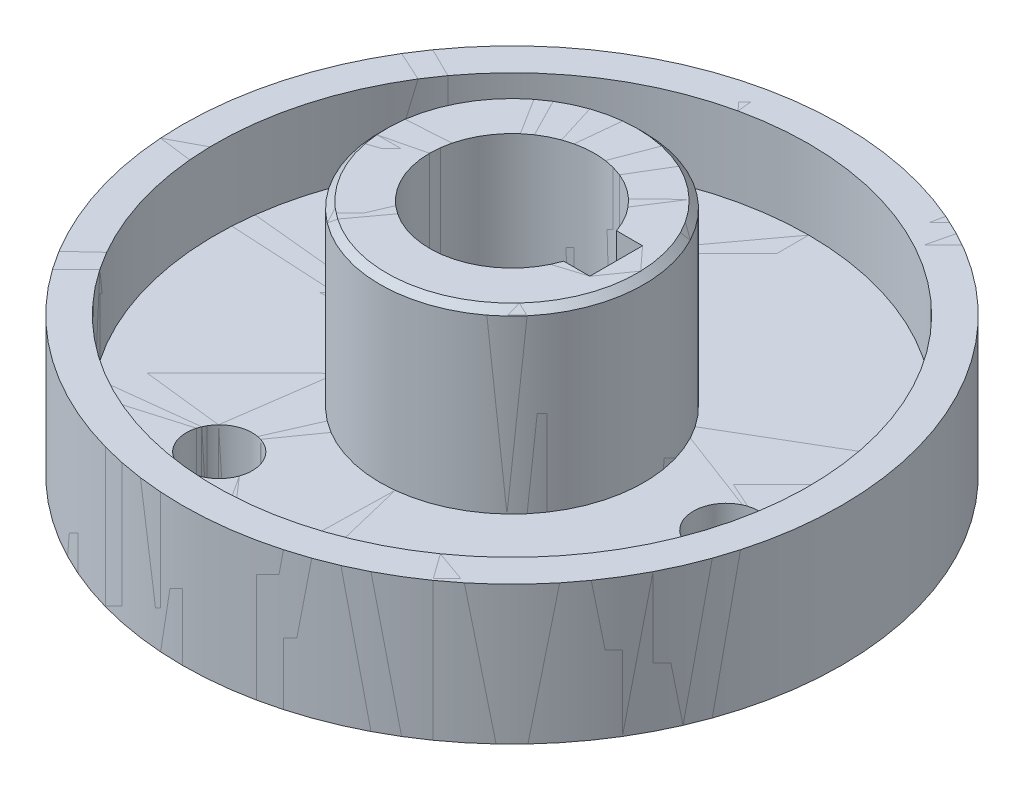
ISO-10303-21;
HEADER;
FILE_DESCRIPTION(('STEP AP214'),'2;1');
FILE_NAME('part.step','',(''),(''),'','','');
FILE_SCHEMA(('AUTOMOTIVE_DESIGN { 1 0 10303 214 1 1 1 1 }'));
ENDSEC;
DATA;
#1=APPLICATION_CONTEXT('core data for automotive mechanical design processes');
#2=APPLICATION_PROTOCOL_DEFINITION('international standard','automotive_design',2000,#1);
#3=PRODUCT_CONTEXT('',#1,'mechanical');
#4=PRODUCT('Part','Part','',(#3));
#5=PRODUCT_RELATED_PRODUCT_CATEGORY('part','',(#4));
#6=PRODUCT_DEFINITION_FORMATION('','',#4);
#7=PRODUCT_DEFINITION_CONTEXT('part definition',#1,'design');
#8=PRODUCT_DEFINITION('design','',#6,#7);
#9=PRODUCT_DEFINITION_SHAPE('','',#8);
#10=(LENGTH_UNIT() NAMED_UNIT(*) SI_UNIT(.MILLI.,.METRE.));
#11=(NAMED_UNIT(*) PLANE_ANGLE_UNIT() SI_UNIT($,.RADIAN.));
#12=(NAMED_UNIT(*) SI_UNIT($,.STERADIAN.) SOLID_ANGLE_UNIT());
#13=UNCERTAINTY_MEASURE_WITH_UNIT(LENGTH_MEASURE(1.E-05),#10,'distance_accuracy_value','');
#14=(GEOMETRIC_REPRESENTATION_CONTEXT(3) GLOBAL_UNCERTAINTY_ASSIGNED_CONTEXT((#13)) GLOBAL_UNIT_ASSIGNED_CONTEXT((#10,
#11,#12)) REPRESENTATION_CONTEXT('',''));
#15=CARTESIAN_POINT('',(0.,0.,0.));
#16=DIRECTION('',(0.,0.,1.));
#17=DIRECTION('',(1.,0.,0.));
#18=AXIS2_PLACEMENT_3D('',#15,#16,#17);
#19=CARTESIAN_POINT('',(0.,13.,20.));
#20=DIRECTION('',(0.,-1.,0.));
#21=DIRECTION('',(0.,0.,-1.));
#22=AXIS2_PLACEMENT_3D('',#19,#20,#21);
#23=PLANE('',#22);
#24=CARTESIAN_POINT('',(32.5,12.9999999999999,0.));
#25=DIRECTION('',(0.,1.,0.));
#26=DIRECTION('',(0.,0.,1.));
#27=AXIS2_PLACEMENT_3D('',#24,#25,#26);
#28=CIRCLE('',#27,4.99999999999999);
#29=CARTESIAN_POINT('',(32.5,12.9999999999999,5.00000000000003));
#30=VERTEX_POINT('',#29);
#31=EDGE_CURVE('E210',#30,#30,#28,.T.);
#32=ORIENTED_EDGE('',*,*,#31,.F.);
#33=EDGE_LOOP('',(#32));
#34=FACE_BOUND('',#33,.T.);
#35=CARTESIAN_POINT('',(-16.25,13.,-28.1458256229942));
#36=DIRECTION('',(0.,1.,0.));
#37=DIRECTION('',(0.,0.,1.));
#38=AXIS2_PLACEMENT_3D('',#35,#36,#37);
#39=CIRCLE('',#38,5.);
#40=CARTESIAN_POINT('',(-16.25,13.,-23.1458256229942));
#41=VERTEX_POINT('',#40);
#42=EDGE_CURVE('E218',#41,#41,#39,.T.);
#43=ORIENTED_EDGE('',*,*,#42,.F.);
#44=EDGE_LOOP('',(#43));
#45=FACE_BOUND('',#44,.T.);
#46=CARTESIAN_POINT('',(0.,13.0000000000001,0.));
#47=DIRECTION('',(0.,-1.,0.));
#48=DIRECTION('',(0.,0.,-1.));
#49=AXIS2_PLACEMENT_3D('',#46,#47,#48);
#50=CIRCLE('',#49,45.);
#51=CARTESIAN_POINT('',(0.,13.0000000000003,-44.9999999999999));
#52=VERTEX_POINT('',#51);
#53=EDGE_CURVE('E165',#52,#52,#50,.T.);
#54=ORIENTED_EDGE('',*,*,#53,.F.);
#55=EDGE_LOOP('',(#54));
#56=FACE_BOUND('',#55,.T.);
#57=CARTESIAN_POINT('',(0.,13.0000000000001,0.));
#58=DIRECTION('',(0.,-1.,0.));
#59=DIRECTION('',(0.,0.,-1.));
#60=AXIS2_PLACEMENT_3D('',#57,#58,#59);
#61=CIRCLE('',#60,20.);
#62=CARTESIAN_POINT('',(0.,13.0000000000002,-19.9999999999999));
#63=VERTEX_POINT('',#62);
#64=EDGE_CURVE('E161',#63,#63,#61,.T.);
#65=ORIENTED_EDGE('',*,*,#64,.T.);
#66=EDGE_LOOP('',(#65));
#67=FACE_BOUND('',#66,.T.);
#68=CARTESIAN_POINT('',(-16.25,12.9999999999998,28.1458256229943));
#69=DIRECTION('',(0.,1.,0.));
#70=DIRECTION('',(0.,0.,1.));
#71=AXIS2_PLACEMENT_3D('',#68,#69,#70);
#72=CIRCLE('',#71,5.);
#73=CARTESIAN_POINT('',(-16.25,12.9999999999998,33.1458256229943));
#74=VERTEX_POINT('',#73);
#75=EDGE_CURVE('E207',#74,#74,#72,.T.);
#76=ORIENTED_EDGE('',*,*,#75,.F.);
#77=EDGE_LOOP('',(#76));
#78=FACE_BOUND('',#77,.T.);
#79=ADVANCED_FACE('F55',(#34,#45,#56,#67,#78),#23,.F.);
#80=CARTESIAN_POINT('',(0.,3.99999999999999,50.));
#81=DIRECTION('',(0.,1.,0.));
#82=DIRECTION('',(0.,0.,1.));
#83=AXIS2_PLACEMENT_3D('',#80,#81,#82);
#84=PLANE('',#83);
#85=CARTESIAN_POINT('',(0.,4.00000000000011,0.));
#86=DIRECTION('',(0.,-1.,0.));
#87=DIRECTION('',(0.,0.,-1.));
#88=AXIS2_PLACEMENT_3D('',#85,#86,#87);
#89=CIRCLE('',#88,42.);
#90=CARTESIAN_POINT('',(0.,4.00000000000026,-42.));
#91=VERTEX_POINT('',#90);
#92=EDGE_CURVE('E138',#91,#91,#89,.T.);
#93=ORIENTED_EDGE('',*,*,#92,.F.);
#94=EDGE_LOOP('',(#93));
#95=FACE_BOUND('',#94,.T.);
#96=CARTESIAN_POINT('',(0.,4.00000000000023,0.));
#97=DIRECTION('',(0.,-1.,0.));
#98=DIRECTION('',(0.,0.,-1.));
#99=AXIS2_PLACEMENT_3D('',#96,#97,#98);
#100=CIRCLE('',#99,50.);
#101=CARTESIAN_POINT('',(0.,4.0000000000004,-50.));
#102=VERTEX_POINT('',#101);
#103=EDGE_CURVE('E64',#102,#102,#100,.T.);
#104=ORIENTED_EDGE('',*,*,#103,.T.);
#105=EDGE_LOOP('',(#104));
#106=FACE_BOUND('',#105,.T.);
#107=ADVANCED_FACE('F57',(#95,#106),#84,.F.);
#108=CARTESIAN_POINT('',(0.,-885.837413968928,-3.03864290244247E-12));
#109=DIRECTION('',(0.,-1.,0.));
#110=DIRECTION('',(0.,0.,-1.));
#111=AXIS2_PLACEMENT_3D('',#108,#109,#110);
#112=CYLINDRICAL_SURFACE('',#111,50.);
#113=ORIENTED_EDGE('',*,*,#103,.F.);
#114=EDGE_LOOP('',(#113));
#115=FACE_BOUND('',#114,.T.);
#116=CARTESIAN_POINT('',(0.,25.0000000000002,0.));
#117=DIRECTION('',(0.,-1.,0.));
#118=DIRECTION('',(0.,0.,-1.));
#119=AXIS2_PLACEMENT_3D('',#116,#117,#118);
#120=CIRCLE('',#119,49.9999999999999);
#121=CARTESIAN_POINT('',(0.,25.0000000000004,-49.9999999999998));
#122=VERTEX_POINT('',#121);
#123=EDGE_CURVE('E173',#122,#122,#120,.T.);
#124=ORIENTED_EDGE('',*,*,#123,.T.);
#125=EDGE_LOOP('',(#124));
#126=FACE_BOUND('',#125,.T.);
#127=ADVANCED_FACE('F181',(#115,#126),#112,.T.);
#128=CARTESIAN_POINT('',(0.,25.,45.));
#129=DIRECTION('',(0.,-1.,0.));
#130=DIRECTION('',(0.,0.,-1.));
#131=AXIS2_PLACEMENT_3D('',#128,#129,#130);
#132=PLANE('',#131);
#133=ORIENTED_EDGE('',*,*,#123,.F.);
#134=EDGE_LOOP('',(#133));
#135=FACE_BOUND('',#134,.T.);
#136=CARTESIAN_POINT('',(0.,25.0000000000001,0.));
#137=DIRECTION('',(0.,-1.,0.));
#138=DIRECTION('',(0.,0.,-1.));
#139=AXIS2_PLACEMENT_3D('',#136,#137,#138);
#140=CIRCLE('',#139,44.9999999999999);
#141=CARTESIAN_POINT('',(0.,25.0000000000003,-44.9999999999998));
#142=VERTEX_POINT('',#141);
#143=EDGE_CURVE('E169',#142,#142,#140,.T.);
#144=ORIENTED_EDGE('',*,*,#143,.T.);
#145=EDGE_LOOP('',(#144));
#146=FACE_BOUND('',#145,.T.);
#147=ADVANCED_FACE('F184',(#135,#146),#132,.F.);
#148=CARTESIAN_POINT('',(0.,-885.837413968928,-3.03864290244247E-12));
#149=DIRECTION('',(0.,-1.,0.));
#150=DIRECTION('',(0.,0.,-1.));
#151=AXIS2_PLACEMENT_3D('',#148,#149,#150);
#152=CYLINDRICAL_SURFACE('',#151,44.9999999999999);
#153=ORIENTED_EDGE('',*,*,#143,.F.);
#154=EDGE_LOOP('',(#153));
#155=FACE_BOUND('',#154,.T.);
#156=ORIENTED_EDGE('',*,*,#53,.T.);
#157=EDGE_LOOP('',(#156));
#158=FACE_BOUND('',#157,.T.);
#159=ADVANCED_FACE('F189',(#155,#158),#152,.F.);
#160=CARTESIAN_POINT('',(0.,-885.837413968928,-3.03864290244247E-12));
#161=DIRECTION('',(0.,-1.,0.));
#162=DIRECTION('',(0.,0.,-1.));
#163=AXIS2_PLACEMENT_3D('',#160,#161,#162);
#164=CYLINDRICAL_SURFACE('',#163,19.9999999999999);
#165=ORIENTED_EDGE('',*,*,#64,.F.);
#166=EDGE_LOOP('',(#165));
#167=FACE_BOUND('',#166,.T.);
#168=CARTESIAN_POINT('',(0.,39.0000000000001,1.33779710956546E-13));
#169=DIRECTION('',(0.,-1.,0.));
#170=DIRECTION('',(0.,0.,-1.));
#171=AXIS2_PLACEMENT_3D('',#168,#169,#170);
#172=CIRCLE('',#171,19.9999999999999);
#173=CARTESIAN_POINT('',(0.,39.0000000000002,-19.9999999999997));
#174=VERTEX_POINT('',#173);
#175=EDGE_CURVE('E157',#174,#174,#172,.T.);
#176=ORIENTED_EDGE('',*,*,#175,.T.);
#177=EDGE_LOOP('',(#176));
#178=FACE_BOUND('',#177,.T.);
#179=ADVANCED_FACE('F195',(#167,#178),#164,.T.);
#180=CARTESIAN_POINT('',(0.,40.0000000000001,1.37209959955431E-13));
#181=DIRECTION('',(0.,-1.,0.));
#182=DIRECTION('',(0.,0.,-1.));
#183=AXIS2_PLACEMENT_3D('',#180,#181,#182);
#184=CONICAL_SURFACE('',#183,18.9999999999999,0.78539816339745);
#185=ORIENTED_EDGE('',*,*,#175,.F.);
#186=EDGE_LOOP('',(#185));
#187=FACE_BOUND('',#186,.T.);
#188=CARTESIAN_POINT('',(0.,40.0000000000001,1.37209959955431E-13));
#189=DIRECTION('',(0.,-1.,0.));
#190=DIRECTION('',(0.,0.,-1.));
#191=AXIS2_PLACEMENT_3D('',#188,#189,#190);
#192=CIRCLE('',#191,18.9999999999999);
#193=CARTESIAN_POINT('',(0.,40.0000000000002,-18.9999999999997));
#194=VERTEX_POINT('',#193);
#195=EDGE_CURVE('E153',#194,#194,#192,.T.);
#196=ORIENTED_EDGE('',*,*,#195,.T.);
#197=EDGE_LOOP('',(#196));
#198=FACE_BOUND('',#197,.T.);
#199=ADVANCED_FACE('F263',(#187,#198),#184,.T.);
#200=CARTESIAN_POINT('',(0.,40.,12.5));
#201=DIRECTION('',(0.,-1.,0.));
#202=DIRECTION('',(0.,0.,-1.));
#203=AXIS2_PLACEMENT_3D('',#200,#201,#202);
#204=PLANE('',#203);
#205=ORIENTED_EDGE('',*,*,#195,.F.);
#206=EDGE_LOOP('',(#205));
#207=FACE_BOUND('',#206,.T.);
#208=DIRECTION('',(0.,0.,-1.));
#209=VECTOR('',#208,1.);
#210=CARTESIAN_POINT('',(15.8000000000001,40.,4.00000000000014));
#211=LINE('',#210,#209);
#212=CARTESIAN_POINT('',(15.8000000000001,40.,4.00000000000014));
#213=VERTEX_POINT('',#212);
#214=CARTESIAN_POINT('',(15.8000000000001,40.0000000000001,-3.99999999999986));
#215=VERTEX_POINT('',#214);
#216=EDGE_CURVE('E102',#213,#215,#211,.T.);
#217=ORIENTED_EDGE('',*,*,#216,.F.);
#218=DIRECTION('',(1.,0.,0.));
#219=VECTOR('',#218,1.);
#220=CARTESIAN_POINT('',(9.19999999999957,40.,4.00000000000014));
#221=LINE('',#220,#219);
#222=CARTESIAN_POINT('',(11.8427192823269,40.,4.00000000000014));
#223=VERTEX_POINT('',#222);
#224=EDGE_CURVE('E117',#223,#213,#221,.T.);
#225=ORIENTED_EDGE('',*,*,#224,.F.);
#226=CARTESIAN_POINT('',(0.,40.,1.37209959955431E-13));
#227=DIRECTION('',(0.,-1.,0.));
#228=DIRECTION('',(0.,0.,-1.));
#229=AXIS2_PLACEMENT_3D('',#226,#227,#228);
#230=CIRCLE('',#229,12.4999999999999);
#231=CARTESIAN_POINT('',(11.8427192823269,40.,-3.99999999999986));
#232=VERTEX_POINT('',#231);
#233=EDGE_CURVE('E149',#223,#232,#230,.T.);
#234=ORIENTED_EDGE('',*,*,#233,.T.);
#235=DIRECTION('',(-1.,0.,0.));
#236=VECTOR('',#235,1.);
#237=CARTESIAN_POINT('',(9.19999999999957,40.0000000000001,-3.99999999999986));
#238=LINE('',#237,#236);
#239=EDGE_CURVE('E120',#215,#232,#238,.T.);
#240=ORIENTED_EDGE('',*,*,#239,.F.);
#241=EDGE_LOOP('',(#217,#225,#234,#240));
#242=FACE_BOUND('',#241,.T.);
#243=ADVANCED_FACE('F259',(#207,#242),#204,.F.);
#244=CARTESIAN_POINT('',(0.,-885.837413968928,-3.03864290244247E-12));
#245=DIRECTION('',(0.,-1.,0.));
#246=DIRECTION('',(0.,0.,-1.));
#247=AXIS2_PLACEMENT_3D('',#244,#245,#246);
#248=CYLINDRICAL_SURFACE('',#247,12.4999999999999);
#249=ORIENTED_EDGE('',*,*,#233,.F.);
#250=DIRECTION('',(0.,-1.,0.));
#251=VECTOR('',#250,1.);
#252=CARTESIAN_POINT('',(11.8427192823269,-885.837413968928,3.99999999999696));
#253=LINE('',#252,#251);
#254=CARTESIAN_POINT('',(11.842719282327,-1.52655665885959E-13,4.));
#255=VERTEX_POINT('',#254);
#256=EDGE_CURVE('E135',#223,#255,#253,.T.);
#257=ORIENTED_EDGE('',*,*,#256,.T.);
#258=CARTESIAN_POINT('',(0.,0.,0.));
#259=DIRECTION('',(0.,-1.,0.));
#260=DIRECTION('',(0.,0.,-1.));
#261=AXIS2_PLACEMENT_3D('',#258,#259,#260);
#262=CIRCLE('',#261,12.5);
#263=CARTESIAN_POINT('',(11.842719282327,0.,-4.));
#264=VERTEX_POINT('',#263);
#265=EDGE_CURVE('E146',#255,#264,#262,.T.);
#266=ORIENTED_EDGE('',*,*,#265,.T.);
#267=DIRECTION('',(0.,-1.,0.));
#268=VECTOR('',#267,1.);
#269=CARTESIAN_POINT('',(11.8427192823269,-885.837413968928,-4.00000000000304));
#270=LINE('',#269,#268);
#271=EDGE_CURVE('E71',#264,#232,#270,.F.);
#272=ORIENTED_EDGE('',*,*,#271,.T.);
#273=EDGE_LOOP('',(#249,#257,#266,#272));
#274=FACE_BOUND('',#273,.T.);
#275=ADVANCED_FACE('F255',(#274),#248,.F.);
#276=CARTESIAN_POINT('',(0.,0.,42.));
#277=DIRECTION('',(0.,1.,0.));
#278=DIRECTION('',(0.,0.,1.));
#279=AXIS2_PLACEMENT_3D('',#276,#277,#278);
#280=PLANE('',#279);
#281=CARTESIAN_POINT('',(32.5,-3.24393290007663E-13,0.));
#282=DIRECTION('',(0.,1.,0.));
#283=DIRECTION('',(0.,0.,1.));
#284=AXIS2_PLACEMENT_3D('',#281,#282,#283);
#285=CIRCLE('',#284,4.99999999999999);
#286=CARTESIAN_POINT('',(32.5,-3.41544535002092E-13,4.99999999999999));
#287=VERTEX_POINT('',#286);
#288=EDGE_CURVE('E128',#287,#287,#285,.T.);
#289=ORIENTED_EDGE('',*,*,#288,.T.);
#290=EDGE_LOOP('',(#289));
#291=FACE_BOUND('',#290,.T.);
#292=CARTESIAN_POINT('',(-16.25,-4.21537804662364E-13,28.1458256229943));
#293=DIRECTION('',(0.,1.,0.));
#294=DIRECTION('',(0.,0.,1.));
#295=AXIS2_PLACEMENT_3D('',#292,#293,#294);
#296=CIRCLE('',#295,5.);
#297=CARTESIAN_POINT('',(-16.25,-4.38689049656793E-13,33.1458256229943));
#298=VERTEX_POINT('',#297);
#299=EDGE_CURVE('E211',#298,#298,#296,.T.);
#300=ORIENTED_EDGE('',*,*,#299,.T.);
#301=EDGE_LOOP('',(#300));
#302=FACE_BOUND('',#301,.T.);
#303=CARTESIAN_POINT('',(-16.25,-2.27248775352962E-13,-28.1458256229943));
#304=DIRECTION('',(0.,1.,0.));
#305=DIRECTION('',(0.,0.,1.));
#306=AXIS2_PLACEMENT_3D('',#303,#304,#305);
#307=CIRCLE('',#306,5.);
#308=CARTESIAN_POINT('',(-16.25,-2.44400020347391E-13,-23.1458256229943));
#309=VERTEX_POINT('',#308);
#310=EDGE_CURVE('E123',#309,#309,#307,.T.);
#311=ORIENTED_EDGE('',*,*,#310,.T.);
#312=EDGE_LOOP('',(#311));
#313=FACE_BOUND('',#312,.T.);
#314=ORIENTED_EDGE('',*,*,#265,.F.);
#315=DIRECTION('',(1.,0.,0.));
#316=VECTOR('',#315,1.);
#317=CARTESIAN_POINT('',(0.,0.,4.));
#318=LINE('',#317,#316);
#319=CARTESIAN_POINT('',(15.8000000000001,-1.52655665885959E-13,4.));
#320=VERTEX_POINT('',#319);
#321=EDGE_CURVE('E12',#255,#320,#318,.T.);
#322=ORIENTED_EDGE('',*,*,#321,.T.);
#323=DIRECTION('',(0.,0.,-1.));
#324=VECTOR('',#323,1.);
#325=CARTESIAN_POINT('',(15.8000000000001,-1.52655665885959E-13,4.));
#326=LINE('',#325,#324);
#327=CARTESIAN_POINT('',(15.8000000000001,-1.2490009027033E-13,-4.));
#328=VERTEX_POINT('',#327);
#329=EDGE_CURVE('E100',#320,#328,#326,.T.);
#330=ORIENTED_EDGE('',*,*,#329,.T.);
#331=DIRECTION('',(-1.,0.,0.));
#332=VECTOR('',#331,1.);
#333=CARTESIAN_POINT('',(9.19999999999957,-1.2490009027033E-13,-4.));
#334=LINE('',#333,#332);
#335=EDGE_CURVE('E106',#328,#264,#334,.T.);
#336=ORIENTED_EDGE('',*,*,#335,.T.);
#337=EDGE_LOOP('',(#314,#322,#330,#336));
#338=FACE_BOUND('',#337,.T.);
#339=CARTESIAN_POINT('',(0.,1.11022302462516E-13,0.));
#340=DIRECTION('',(0.,-1.,0.));
#341=DIRECTION('',(0.,0.,-1.));
#342=AXIS2_PLACEMENT_3D('',#339,#340,#341);
#343=CIRCLE('',#342,42.);
#344=CARTESIAN_POINT('',(0.,2.55092760415718E-13,-42.));
#345=VERTEX_POINT('',#344);
#346=EDGE_CURVE('E142',#345,#345,#343,.T.);
#347=ORIENTED_EDGE('',*,*,#346,.T.);
#348=EDGE_LOOP('',(#347));
#349=FACE_BOUND('',#348,.T.);
#350=ADVANCED_FACE('F114',(#291,#302,#313,#338,#349),#280,.F.);
#351=CARTESIAN_POINT('',(0.,-885.837413968928,-3.03864290244247E-12));
#352=DIRECTION('',(0.,-1.,0.));
#353=DIRECTION('',(0.,0.,-1.));
#354=AXIS2_PLACEMENT_3D('',#351,#352,#353);
#355=CYLINDRICAL_SURFACE('',#354,42.);
#356=ORIENTED_EDGE('',*,*,#346,.F.);
#357=EDGE_LOOP('',(#356));
#358=FACE_BOUND('',#357,.T.);
#359=ORIENTED_EDGE('',*,*,#92,.T.);
#360=EDGE_LOOP('',(#359));
#361=FACE_BOUND('',#360,.T.);
#362=ADVANCED_FACE('F248',(#358,#361),#355,.T.);
#363=CARTESIAN_POINT('',(9.19999999999957,-1.52655665885959E-13,4.));
#364=DIRECTION('',(0.,0.,1.));
#365=DIRECTION('',(0.,-1.,0.));
#366=AXIS2_PLACEMENT_3D('',#363,#364,#365);
#367=PLANE('',#366);
#368=ORIENTED_EDGE('',*,*,#224,.T.);
#369=DIRECTION('',(0.,1.,0.));
#370=VECTOR('',#369,1.);
#371=CARTESIAN_POINT('',(15.8000000000001,-1.52655665885959E-13,4.));
#372=LINE('',#371,#370);
#373=EDGE_CURVE('E105',#320,#213,#372,.T.);
#374=ORIENTED_EDGE('',*,*,#373,.F.);
#375=ORIENTED_EDGE('',*,*,#321,.F.);
#376=ORIENTED_EDGE('',*,*,#256,.F.);
#377=EDGE_LOOP('',(#368,#374,#375,#376));
#378=FACE_BOUND('',#377,.T.);
#379=ADVANCED_FACE('F245',(#378),#367,.F.);
#380=CARTESIAN_POINT('',(9.19999999999957,-1.2490009027033E-13,-4.));
#381=DIRECTION('',(0.,0.,-1.));
#382=DIRECTION('',(0.,1.,0.));
#383=AXIS2_PLACEMENT_3D('',#380,#381,#382);
#384=PLANE('',#383);
#385=ORIENTED_EDGE('',*,*,#335,.F.);
#386=DIRECTION('',(0.,1.,0.));
#387=VECTOR('',#386,1.);
#388=CARTESIAN_POINT('',(15.8000000000001,-1.2490009027033E-13,-4.));
#389=LINE('',#388,#387);
#390=EDGE_CURVE('E96',#328,#215,#389,.T.);
#391=ORIENTED_EDGE('',*,*,#390,.T.);
#392=ORIENTED_EDGE('',*,*,#239,.T.);
#393=ORIENTED_EDGE('',*,*,#271,.F.);
#394=EDGE_LOOP('',(#385,#391,#392,#393));
#395=FACE_BOUND('',#394,.T.);
#396=ADVANCED_FACE('F108',(#395),#384,.F.);
#397=CARTESIAN_POINT('',(15.8000000000001,-1.52655665885959E-13,4.));
#398=DIRECTION('',(1.,0.,0.));
#399=DIRECTION('',(0.,0.,-1.));
#400=AXIS2_PLACEMENT_3D('',#397,#398,#399);
#401=PLANE('',#400);
#402=ORIENTED_EDGE('',*,*,#216,.T.);
#403=ORIENTED_EDGE('',*,*,#390,.F.);
#404=ORIENTED_EDGE('',*,*,#329,.F.);
#405=ORIENTED_EDGE('',*,*,#373,.T.);
#406=EDGE_LOOP('',(#402,#403,#404,#405));
#407=FACE_BOUND('',#406,.T.);
#408=ADVANCED_FACE('F97',(#407),#401,.F.);
#409=CARTESIAN_POINT('',(-16.25,-2.27248775352962E-13,-28.1458256229943));
#410=DIRECTION('',(0.,1.,0.));
#411=DIRECTION('',(0.,0.,1.));
#412=AXIS2_PLACEMENT_3D('',#409,#410,#411);
#413=CYLINDRICAL_SURFACE('',#412,5.);
#414=ORIENTED_EDGE('',*,*,#310,.F.);
#415=EDGE_LOOP('',(#414));
#416=FACE_BOUND('',#415,.T.);
#417=ORIENTED_EDGE('',*,*,#42,.T.);
#418=EDGE_LOOP('',(#417));
#419=FACE_BOUND('',#418,.T.);
#420=ADVANCED_FACE('F230',(#416,#419),#413,.F.);
#421=CARTESIAN_POINT('',(-16.25,-4.21537804662364E-13,28.1458256229943));
#422=DIRECTION('',(0.,1.,0.));
#423=DIRECTION('',(0.,0.,1.));
#424=AXIS2_PLACEMENT_3D('',#421,#422,#423);
#425=CYLINDRICAL_SURFACE('',#424,5.);
#426=ORIENTED_EDGE('',*,*,#299,.F.);
#427=EDGE_LOOP('',(#426));
#428=FACE_BOUND('',#427,.T.);
#429=ORIENTED_EDGE('',*,*,#75,.T.);
#430=EDGE_LOOP('',(#429));
#431=FACE_BOUND('',#430,.T.);
#432=ADVANCED_FACE('F232',(#428,#431),#425,.F.);
#433=CARTESIAN_POINT('',(32.5,-3.24393290007663E-13,0.));
#434=DIRECTION('',(0.,1.,0.));
#435=DIRECTION('',(0.,0.,1.));
#436=AXIS2_PLACEMENT_3D('',#433,#434,#435);
#437=CYLINDRICAL_SURFACE('',#436,4.99999999999999);
#438=ORIENTED_EDGE('',*,*,#288,.F.);
#439=EDGE_LOOP('',(#438));
#440=FACE_BOUND('',#439,.T.);
#441=ORIENTED_EDGE('',*,*,#31,.T.);
#442=EDGE_LOOP('',(#441));
#443=FACE_BOUND('',#442,.T.);
#444=ADVANCED_FACE('F238',(#440,#443),#437,.F.);
#445=CLOSED_SHELL('',(#79,#107,#127,#147,#159,#179,#199,#243,#275,#350,#362,#379,#396,#408,#420,
#432,#444));
#446=MANIFOLD_SOLID_BREP('B2',#445);
#447=CARTESIAN_POINT('',(0.,0.,-42.));
#448=DIRECTION('',(0.,-1.,0.));
#449=DIRECTION('',(0.,0.,-1.));
#450=AXIS2_PLACEMENT_3D('',#447,#448,#449);
#451=PLANE('',#450);
#452=CARTESIAN_POINT('',(32.5,-3.24393290007663E-13,0.));
#453=DIRECTION('',(0.,1.,0.));
#454=DIRECTION('',(0.,0.,1.));
#455=AXIS2_PLACEMENT_3D('',#452,#453,#454);
#456=CIRCLE('',#455,4.99999999999999);
#457=CARTESIAN_POINT('',(32.5,-3.41544535002092E-13,4.99999999999999));
#458=VERTEX_POINT('',#457);
#459=EDGE_CURVE('E460',#458,#458,#456,.T.);
#460=ORIENTED_EDGE('',*,*,#459,.T.);
#461=EDGE_LOOP('',(#460));
#462=FACE_BOUND('',#461,.T.);
#463=CARTESIAN_POINT('',(-16.25,-4.21537804662364E-13,28.1458256229943));
#464=DIRECTION('',(0.,1.,0.));
#465=DIRECTION('',(0.,0.,1.));
#466=AXIS2_PLACEMENT_3D('',#463,#464,#465);
#467=CIRCLE('',#466,5.);
#468=CARTESIAN_POINT('',(-16.25,-4.38689049656793E-13,33.1458256229943));
#469=VERTEX_POINT('',#468);
#470=EDGE_CURVE('E567',#469,#469,#467,.T.);
#471=ORIENTED_EDGE('',*,*,#470,.T.);
#472=EDGE_LOOP('',(#471));
#473=FACE_BOUND('',#472,.T.);
#474=CARTESIAN_POINT('',(-16.25,-2.27248775352962E-13,-28.1458256229943));
#475=DIRECTION('',(0.,1.,0.));
#476=DIRECTION('',(0.,0.,1.));
#477=AXIS2_PLACEMENT_3D('',#474,#475,#476);
#478=CIRCLE('',#477,5.);
#479=CARTESIAN_POINT('',(-16.25,-2.44400020347391E-13,-23.1458256229943));
#480=VERTEX_POINT('',#479);
#481=EDGE_CURVE('E456',#480,#480,#478,.T.);
#482=ORIENTED_EDGE('',*,*,#481,.T.);
#483=EDGE_LOOP('',(#482));
#484=FACE_BOUND('',#483,.T.);
#485=DIRECTION('',(1.,0.,0.));
#486=VECTOR('',#485,1.);
#487=CARTESIAN_POINT('',(9.19999999999957,-1.52655665885959E-13,4.));
#488=LINE('',#487,#486);
#489=CARTESIAN_POINT('',(11.8427192823271,-1.2490009027033E-13,4.));
#490=VERTEX_POINT('',#489);
#491=CARTESIAN_POINT('',(15.8000000000001,-1.52655665885959E-13,4.));
#492=VERTEX_POINT('',#491);
#493=EDGE_CURVE('E417',#490,#492,#488,.T.);
#494=ORIENTED_EDGE('',*,*,#493,.T.);
#495=DIRECTION('',(0.,0.,-1.));
#496=VECTOR('',#495,1.);
#497=CARTESIAN_POINT('',(15.8000000000001,-1.52655665885959E-13,4.));
#498=LINE('',#497,#496);
#499=CARTESIAN_POINT('',(15.8000000000001,-1.2490009027033E-13,-4.));
#500=VERTEX_POINT('',#499);
#501=EDGE_CURVE('E437',#492,#500,#498,.T.);
#502=ORIENTED_EDGE('',*,*,#501,.T.);
#503=DIRECTION('',(-1.,0.,0.));
#504=VECTOR('',#503,1.);
#505=CARTESIAN_POINT('',(9.19999999999957,-1.2490009027033E-13,-4.));
#506=LINE('',#505,#504);
#507=CARTESIAN_POINT('',(11.8427192823271,0.,-4.));
#508=VERTEX_POINT('',#507);
#509=EDGE_CURVE('E443',#500,#508,#506,.T.);
#510=ORIENTED_EDGE('',*,*,#509,.T.);
#511=CARTESIAN_POINT('',(0.,0.,0.));
#512=DIRECTION('',(0.,-1.,0.));
#513=DIRECTION('',(0.,0.,-1.));
#514=AXIS2_PLACEMENT_3D('',#511,#512,#513);
#515=CIRCLE('',#514,12.5);
#516=EDGE_CURVE('E402',#490,#508,#515,.T.);
#517=ORIENTED_EDGE('',*,*,#516,.F.);
#518=EDGE_LOOP('',(#494,#502,#510,#517));
#519=FACE_BOUND('',#518,.T.);
#520=CARTESIAN_POINT('',(0.,-1.11022302462516E-13,0.));
#521=DIRECTION('',(0.,-1.,0.));
#522=DIRECTION('',(0.,0.,-1.));
#523=AXIS2_PLACEMENT_3D('',#520,#521,#522);
#524=CIRCLE('',#523,42.);
#525=CARTESIAN_POINT('',(0.,0.,-42.));
#526=VERTEX_POINT('',#525);
#527=EDGE_CURVE('E466',#526,#526,#524,.T.);
#528=ORIENTED_EDGE('',*,*,#527,.T.);
#529=EDGE_LOOP('',(#528));
#530=FACE_BOUND('',#529,.T.);
#531=ADVANCED_FACE('F395',(#462,#473,#484,#519,#530),#451,.T.);
#532=CARTESIAN_POINT('',(0.,-885.837413968928,-3.03864290244247E-12));
#533=DIRECTION('',(0.,-1.,0.));
#534=DIRECTION('',(0.,0.,-1.));
#535=AXIS2_PLACEMENT_3D('',#532,#533,#534);
#536=CYLINDRICAL_SURFACE('',#535,12.5);
#537=DIRECTION('',(0.,-1.,0.));
#538=VECTOR('',#537,1.);
#539=CARTESIAN_POINT('',(11.8427192823271,-885.837413968928,3.99999999999696));
#540=LINE('',#539,#538);
#541=CARTESIAN_POINT('',(11.8427192823272,40.,4.00000000000014));
#542=VERTEX_POINT('',#541);
#543=EDGE_CURVE('E464',#490,#542,#540,.F.);
#544=ORIENTED_EDGE('',*,*,#543,.F.);
#545=ORIENTED_EDGE('',*,*,#516,.T.);
#546=DIRECTION('',(0.,-1.,0.));
#547=VECTOR('',#546,1.);
#548=CARTESIAN_POINT('',(11.8427192823271,-885.837413968928,-4.00000000000304));
#549=LINE('',#548,#547);
#550=CARTESIAN_POINT('',(11.8427192823272,40.0000000000001,-3.99999999999986));
#551=VERTEX_POINT('',#550);
#552=EDGE_CURVE('E446',#551,#508,#549,.T.);
#553=ORIENTED_EDGE('',*,*,#552,.F.);
#554=CARTESIAN_POINT('',(0.,40.,1.37209959955431E-13));
#555=DIRECTION('',(0.,-1.,0.));
#556=DIRECTION('',(0.,0.,-1.));
#557=AXIS2_PLACEMENT_3D('',#554,#555,#556);
#558=CIRCLE('',#557,12.5000000000001);
#559=EDGE_CURVE('E493',#542,#551,#558,.T.);
#560=ORIENTED_EDGE('',*,*,#559,.F.);
#561=EDGE_LOOP('',(#544,#545,#553,#560));
#562=FACE_BOUND('',#561,.T.);
#563=ADVANCED_FACE('F496',(#562),#536,.F.);
#564=CARTESIAN_POINT('',(0.,40.,-12.5));
#565=DIRECTION('',(0.,1.,0.));
#566=DIRECTION('',(0.,0.,1.));
#567=AXIS2_PLACEMENT_3D('',#564,#565,#566);
#568=PLANE('',#567);
#569=DIRECTION('',(1.,0.,0.));
#570=VECTOR('',#569,1.);
#571=CARTESIAN_POINT('',(0.,39.9999999999999,4.00000000000014));
#572=LINE('',#571,#570);
#573=CARTESIAN_POINT('',(15.8000000000001,40.,4.00000000000014));
#574=VERTEX_POINT('',#573);
#575=EDGE_CURVE('E53',#542,#574,#572,.T.);
#576=ORIENTED_EDGE('',*,*,#575,.F.);
#577=ORIENTED_EDGE('',*,*,#559,.T.);
#578=DIRECTION('',(-1.,0.,0.));
#579=VECTOR('',#578,1.);
#580=CARTESIAN_POINT('',(9.19999999999957,40.0000000000001,-3.99999999999986));
#581=LINE('',#580,#579);
#582=CARTESIAN_POINT('',(15.8000000000001,40.,-3.99999999999986));
#583=VERTEX_POINT('',#582);
#584=EDGE_CURVE('E452',#583,#551,#581,.T.);
#585=ORIENTED_EDGE('',*,*,#584,.F.);
#586=DIRECTION('',(0.,0.,-1.));
#587=VECTOR('',#586,1.);
#588=CARTESIAN_POINT('',(15.8000000000001,40.,4.00000000000014));
#589=LINE('',#588,#587);
#590=EDGE_CURVE('E409',#574,#583,#589,.T.);
#591=ORIENTED_EDGE('',*,*,#590,.F.);
#592=EDGE_LOOP('',(#576,#577,#585,#591));
#593=FACE_BOUND('',#592,.T.);
#594=CARTESIAN_POINT('',(0.,39.9999999999999,1.37209959955431E-13));
#595=DIRECTION('',(0.,-1.,0.));
#596=DIRECTION('',(0.,0.,-1.));
#597=AXIS2_PLACEMENT_3D('',#594,#595,#596);
#598=CIRCLE('',#597,19.0000000000001);
#599=CARTESIAN_POINT('',(0.,40.,-19.));
#600=VERTEX_POINT('',#599);
#601=EDGE_CURVE('E490',#600,#600,#598,.T.);
#602=ORIENTED_EDGE('',*,*,#601,.F.);
#603=EDGE_LOOP('',(#602));
#604=FACE_BOUND('',#603,.T.);
#605=ADVANCED_FACE('F501',(#593,#604),#568,.T.);
#606=CARTESIAN_POINT('',(0.,38.9999999999999,1.33779710956545E-13));
#607=DIRECTION('',(0.,-1.,0.));
#608=DIRECTION('',(0.,0.,-1.));
#609=AXIS2_PLACEMENT_3D('',#606,#607,#608);
#610=CONICAL_SURFACE('',#609,20.0000000000001,0.785398163397447);
#611=ORIENTED_EDGE('',*,*,#601,.T.);
#612=EDGE_LOOP('',(#611));
#613=FACE_BOUND('',#612,.T.);
#614=CARTESIAN_POINT('',(0.,38.9999999999999,1.33779710956545E-13));
#615=DIRECTION('',(0.,-1.,0.));
#616=DIRECTION('',(0.,0.,-1.));
#617=AXIS2_PLACEMENT_3D('',#614,#615,#616);
#618=CIRCLE('',#617,20.0000000000001);
#619=CARTESIAN_POINT('',(0.,39.,-20.));
#620=VERTEX_POINT('',#619);
#621=EDGE_CURVE('E487',#620,#620,#618,.T.);
#622=ORIENTED_EDGE('',*,*,#621,.F.);
#623=EDGE_LOOP('',(#622));
#624=FACE_BOUND('',#623,.T.);
#625=ADVANCED_FACE('F504',(#613,#624),#610,.T.);
#626=CARTESIAN_POINT('',(0.,-885.837413968928,-3.03864290244247E-12));
#627=DIRECTION('',(0.,-1.,0.));
#628=DIRECTION('',(0.,0.,-1.));
#629=AXIS2_PLACEMENT_3D('',#626,#627,#628);
#630=CYLINDRICAL_SURFACE('',#629,20.0000000000001);
#631=ORIENTED_EDGE('',*,*,#621,.T.);
#632=EDGE_LOOP('',(#631));
#633=FACE_BOUND('',#632,.T.);
#634=CARTESIAN_POINT('',(0.,12.9999999999999,0.));
#635=DIRECTION('',(0.,-1.,0.));
#636=DIRECTION('',(0.,0.,-1.));
#637=AXIS2_PLACEMENT_3D('',#634,#635,#636);
#638=CIRCLE('',#637,20.);
#639=CARTESIAN_POINT('',(0.,13.,-20.));
#640=VERTEX_POINT('',#639);
#641=EDGE_CURVE('E484',#640,#640,#638,.T.);
#642=ORIENTED_EDGE('',*,*,#641,.F.);
#643=EDGE_LOOP('',(#642));
#644=FACE_BOUND('',#643,.T.);
#645=ADVANCED_FACE('F510',(#633,#644),#630,.T.);
#646=CARTESIAN_POINT('',(0.,13.,-20.));
#647=DIRECTION('',(0.,1.,0.));
#648=DIRECTION('',(0.,0.,1.));
#649=AXIS2_PLACEMENT_3D('',#646,#647,#648);
#650=PLANE('',#649);
#651=CARTESIAN_POINT('',(-16.25,12.9999999999998,28.1458256229943));
#652=DIRECTION('',(0.,1.,0.));
#653=DIRECTION('',(0.,0.,1.));
#654=AXIS2_PLACEMENT_3D('',#651,#652,#653);
#655=CIRCLE('',#654,5.);
#656=CARTESIAN_POINT('',(-16.25,12.9999999999998,33.1458256229943));
#657=VERTEX_POINT('',#656);
#658=EDGE_CURVE('E575',#657,#657,#655,.T.);
#659=ORIENTED_EDGE('',*,*,#658,.F.);
#660=EDGE_LOOP('',(#659));
#661=FACE_BOUND('',#660,.T.);
#662=CARTESIAN_POINT('',(32.5,12.9999999999999,0.));
#663=DIRECTION('',(0.,1.,0.));
#664=DIRECTION('',(0.,0.,1.));
#665=AXIS2_PLACEMENT_3D('',#662,#663,#664);
#666=CIRCLE('',#665,4.99999999999999);
#667=CARTESIAN_POINT('',(32.5,12.9999999999999,5.00000000000003));
#668=VERTEX_POINT('',#667);
#669=EDGE_CURVE('E580',#668,#668,#666,.T.);
#670=ORIENTED_EDGE('',*,*,#669,.F.);
#671=EDGE_LOOP('',(#670));
#672=FACE_BOUND('',#671,.T.);
#673=CARTESIAN_POINT('',(-16.25,13.,-28.1458256229942));
#674=DIRECTION('',(0.,1.,0.));
#675=DIRECTION('',(0.,0.,1.));
#676=AXIS2_PLACEMENT_3D('',#673,#674,#675);
#677=CIRCLE('',#676,5.);
#678=CARTESIAN_POINT('',(-16.25,13.,-23.1458256229942));
#679=VERTEX_POINT('',#678);
#680=EDGE_CURVE('E571',#679,#679,#677,.T.);
#681=ORIENTED_EDGE('',*,*,#680,.F.);
#682=EDGE_LOOP('',(#681));
#683=FACE_BOUND('',#682,.T.);
#684=ORIENTED_EDGE('',*,*,#641,.T.);
#685=EDGE_LOOP('',(#684));
#686=FACE_BOUND('',#685,.T.);
#687=CARTESIAN_POINT('',(0.,12.9999999999999,0.));
#688=DIRECTION('',(0.,-1.,0.));
#689=DIRECTION('',(0.,0.,-1.));
#690=AXIS2_PLACEMENT_3D('',#687,#688,#689);
#691=CIRCLE('',#690,45.);
#692=CARTESIAN_POINT('',(0.,13.0000000000001,-45.));
#693=VERTEX_POINT('',#692);
#694=EDGE_CURVE('E481',#693,#693,#691,.T.);
#695=ORIENTED_EDGE('',*,*,#694,.F.);
#696=EDGE_LOOP('',(#695));
#697=FACE_BOUND('',#696,.T.);
#698=ADVANCED_FACE('F516',(#661,#672,#683,#686,#697),#650,.T.);
#699=CARTESIAN_POINT('',(0.,-885.837413968928,-3.03864290244247E-12));
#700=DIRECTION('',(0.,-1.,0.));
#701=DIRECTION('',(0.,0.,-1.));
#702=AXIS2_PLACEMENT_3D('',#699,#700,#701);
#703=CYLINDRICAL_SURFACE('',#702,45.0000000000001);
#704=ORIENTED_EDGE('',*,*,#694,.T.);
#705=EDGE_LOOP('',(#704));
#706=FACE_BOUND('',#705,.T.);
#707=CARTESIAN_POINT('',(0.,24.9999999999999,0.));
#708=DIRECTION('',(0.,-1.,0.));
#709=DIRECTION('',(0.,0.,-1.));
#710=AXIS2_PLACEMENT_3D('',#707,#708,#709);
#711=CIRCLE('',#710,45.0000000000001);
#712=CARTESIAN_POINT('',(0.,25.0000000000001,-45.));
#713=VERTEX_POINT('',#712);
#714=EDGE_CURVE('E478',#713,#713,#711,.T.);
#715=ORIENTED_EDGE('',*,*,#714,.F.);
#716=EDGE_LOOP('',(#715));
#717=FACE_BOUND('',#716,.T.);
#718=ADVANCED_FACE('F522',(#706,#717),#703,.F.);
#719=CARTESIAN_POINT('',(0.,25.,-45.));
#720=DIRECTION('',(0.,1.,0.));
#721=DIRECTION('',(0.,0.,1.));
#722=AXIS2_PLACEMENT_3D('',#719,#720,#721);
#723=PLANE('',#722);
#724=ORIENTED_EDGE('',*,*,#714,.T.);
#725=EDGE_LOOP('',(#724));
#726=FACE_BOUND('',#725,.T.);
#727=CARTESIAN_POINT('',(0.,24.9999999999998,0.));
#728=DIRECTION('',(0.,-1.,0.));
#729=DIRECTION('',(0.,0.,-1.));
#730=AXIS2_PLACEMENT_3D('',#727,#728,#729);
#731=CIRCLE('',#730,50.0000000000001);
#732=CARTESIAN_POINT('',(0.,25.,-50.));
#733=VERTEX_POINT('',#732);
#734=EDGE_CURVE('E475',#733,#733,#731,.T.);
#735=ORIENTED_EDGE('',*,*,#734,.F.);
#736=EDGE_LOOP('',(#735));
#737=FACE_BOUND('',#736,.T.);
#738=ADVANCED_FACE('F529',(#726,#737),#723,.T.);
#739=CARTESIAN_POINT('',(0.,-885.837413968928,-3.03864290244247E-12));
#740=DIRECTION('',(0.,-1.,0.));
#741=DIRECTION('',(0.,0.,-1.));
#742=AXIS2_PLACEMENT_3D('',#739,#740,#741);
#743=CYLINDRICAL_SURFACE('',#742,50.);
#744=ORIENTED_EDGE('',*,*,#734,.T.);
#745=EDGE_LOOP('',(#744));
#746=FACE_BOUND('',#745,.T.);
#747=CARTESIAN_POINT('',(0.,3.99999999999978,0.));
#748=DIRECTION('',(0.,-1.,0.));
#749=DIRECTION('',(0.,0.,-1.));
#750=AXIS2_PLACEMENT_3D('',#747,#748,#749);
#751=CIRCLE('',#750,50.);
#752=CARTESIAN_POINT('',(0.,3.99999999999995,-50.));
#753=VERTEX_POINT('',#752);
#754=EDGE_CURVE('E472',#753,#753,#751,.T.);
#755=ORIENTED_EDGE('',*,*,#754,.F.);
#756=EDGE_LOOP('',(#755));
#757=FACE_BOUND('',#756,.T.);
#758=ADVANCED_FACE('F535',(#746,#757),#743,.T.);
#759=CARTESIAN_POINT('',(0.,4.00000000000001,-50.));
#760=DIRECTION('',(0.,-1.,0.));
#761=DIRECTION('',(0.,0.,-1.));
#762=AXIS2_PLACEMENT_3D('',#759,#760,#761);
#763=PLANE('',#762);
#764=ORIENTED_EDGE('',*,*,#754,.T.);
#765=EDGE_LOOP('',(#764));
#766=FACE_BOUND('',#765,.T.);
#767=CARTESIAN_POINT('',(0.,3.99999999999989,0.));
#768=DIRECTION('',(0.,-1.,0.));
#769=DIRECTION('',(0.,0.,-1.));
#770=AXIS2_PLACEMENT_3D('',#767,#768,#769);
#771=CIRCLE('',#770,42.);
#772=CARTESIAN_POINT('',(0.,4.00000000000004,-42.));
#773=VERTEX_POINT('',#772);
#774=EDGE_CURVE('E469',#773,#773,#771,.T.);
#775=ORIENTED_EDGE('',*,*,#774,.F.);
#776=EDGE_LOOP('',(#775));
#777=FACE_BOUND('',#776,.T.);
#778=ADVANCED_FACE('F541',(#766,#777),#763,.T.);
#779=CARTESIAN_POINT('',(0.,-885.837413968928,-3.03864290244247E-12));
#780=DIRECTION('',(0.,-1.,0.));
#781=DIRECTION('',(0.,0.,-1.));
#782=AXIS2_PLACEMENT_3D('',#779,#780,#781);
#783=CYLINDRICAL_SURFACE('',#782,42.);
#784=ORIENTED_EDGE('',*,*,#774,.T.);
#785=EDGE_LOOP('',(#784));
#786=FACE_BOUND('',#785,.T.);
#787=ORIENTED_EDGE('',*,*,#527,.F.);
#788=EDGE_LOOP('',(#787));
#789=FACE_BOUND('',#788,.T.);
#790=ADVANCED_FACE('F547',(#786,#789),#783,.T.);
#791=CARTESIAN_POINT('',(15.8000000000001,-1.52655665885959E-13,4.));
#792=DIRECTION('',(1.,0.,0.));
#793=DIRECTION('',(0.,0.,-1.));
#794=AXIS2_PLACEMENT_3D('',#791,#792,#793);
#795=PLANE('',#794);
#796=ORIENTED_EDGE('',*,*,#590,.T.);
#797=DIRECTION('',(0.,1.,0.));
#798=VECTOR('',#797,1.);
#799=CARTESIAN_POINT('',(15.8000000000001,-1.2490009027033E-13,-4.));
#800=LINE('',#799,#798);
#801=EDGE_CURVE('E433',#500,#583,#800,.T.);
#802=ORIENTED_EDGE('',*,*,#801,.F.);
#803=ORIENTED_EDGE('',*,*,#501,.F.);
#804=DIRECTION('',(0.,1.,0.));
#805=VECTOR('',#804,1.);
#806=CARTESIAN_POINT('',(15.8000000000001,-1.52655665885959E-13,4.));
#807=LINE('',#806,#805);
#808=EDGE_CURVE('E440',#492,#574,#807,.T.);
#809=ORIENTED_EDGE('',*,*,#808,.T.);
#810=EDGE_LOOP('',(#796,#802,#803,#809));
#811=FACE_BOUND('',#810,.T.);
#812=ADVANCED_FACE('F435',(#811),#795,.F.);
#813=CARTESIAN_POINT('',(9.19999999999957,-1.52655665885959E-13,4.));
#814=DIRECTION('',(0.,0.,1.));
#815=DIRECTION('',(0.,-1.,0.));
#816=AXIS2_PLACEMENT_3D('',#813,#814,#815);
#817=PLANE('',#816);
#818=ORIENTED_EDGE('',*,*,#543,.T.);
#819=ORIENTED_EDGE('',*,*,#575,.T.);
#820=ORIENTED_EDGE('',*,*,#808,.F.);
#821=ORIENTED_EDGE('',*,*,#493,.F.);
#822=EDGE_LOOP('',(#818,#819,#820,#821));
#823=FACE_BOUND('',#822,.T.);
#824=ADVANCED_FACE('F499',(#823),#817,.F.);
#825=CARTESIAN_POINT('',(9.19999999999957,-1.2490009027033E-13,-4.));
#826=DIRECTION('',(0.,0.,-1.));
#827=DIRECTION('',(0.,1.,0.));
#828=AXIS2_PLACEMENT_3D('',#825,#826,#827);
#829=PLANE('',#828);
#830=ORIENTED_EDGE('',*,*,#552,.T.);
#831=ORIENTED_EDGE('',*,*,#509,.F.);
#832=ORIENTED_EDGE('',*,*,#801,.T.);
#833=ORIENTED_EDGE('',*,*,#584,.T.);
#834=EDGE_LOOP('',(#830,#831,#832,#833));
#835=FACE_BOUND('',#834,.T.);
#836=ADVANCED_FACE('F444',(#835),#829,.F.);
#837=CARTESIAN_POINT('',(-16.25,-2.27248775352962E-13,-28.1458256229943));
#838=DIRECTION('',(0.,1.,0.));
#839=DIRECTION('',(0.,0.,1.));
#840=AXIS2_PLACEMENT_3D('',#837,#838,#839);
#841=CYLINDRICAL_SURFACE('',#840,5.);
#842=ORIENTED_EDGE('',*,*,#481,.F.);
#843=EDGE_LOOP('',(#842));
#844=FACE_BOUND('',#843,.T.);
#845=ORIENTED_EDGE('',*,*,#680,.T.);
#846=EDGE_LOOP('',(#845));
#847=FACE_BOUND('',#846,.T.);
#848=ADVANCED_FACE('F590',(#844,#847),#841,.F.);
#849=CARTESIAN_POINT('',(32.5,-3.24393290007663E-13,0.));
#850=DIRECTION('',(0.,1.,0.));
#851=DIRECTION('',(0.,0.,1.));
#852=AXIS2_PLACEMENT_3D('',#849,#850,#851);
#853=CYLINDRICAL_SURFACE('',#852,4.99999999999999);
#854=ORIENTED_EDGE('',*,*,#459,.F.);
#855=EDGE_LOOP('',(#854));
#856=FACE_BOUND('',#855,.T.);
#857=ORIENTED_EDGE('',*,*,#669,.T.);
#858=EDGE_LOOP('',(#857));
#859=FACE_BOUND('',#858,.T.);
#860=ADVANCED_FACE('F585',(#856,#859),#853,.F.);
#861=CARTESIAN_POINT('',(-16.25,-4.21537804662364E-13,28.1458256229943));
#862=DIRECTION('',(0.,1.,0.));
#863=DIRECTION('',(0.,0.,1.));
#864=AXIS2_PLACEMENT_3D('',#861,#862,#863);
#865=CYLINDRICAL_SURFACE('',#864,5.);
#866=ORIENTED_EDGE('',*,*,#470,.F.);
#867=EDGE_LOOP('',(#866));
#868=FACE_BOUND('',#867,.T.);
#869=ORIENTED_EDGE('',*,*,#658,.T.);
#870=EDGE_LOOP('',(#869));
#871=FACE_BOUND('',#870,.T.);
#872=ADVANCED_FACE('F589',(#868,#871),#865,.F.);
#873=CLOSED_SHELL('',(#531,#563,#605,#625,#645,#698,#718,#738,#758,#778,#790,#812,#824,#836,
#848,#860,#872));
#874=MANIFOLD_SOLID_BREP('B6',#873);
#875=ADVANCED_BREP_SHAPE_REPRESENTATION('',(#18,#446,#874),#14);
#876=SHAPE_DEFINITION_REPRESENTATION(#9,#875);
ENDSEC;
END-ISO-10303-21;
